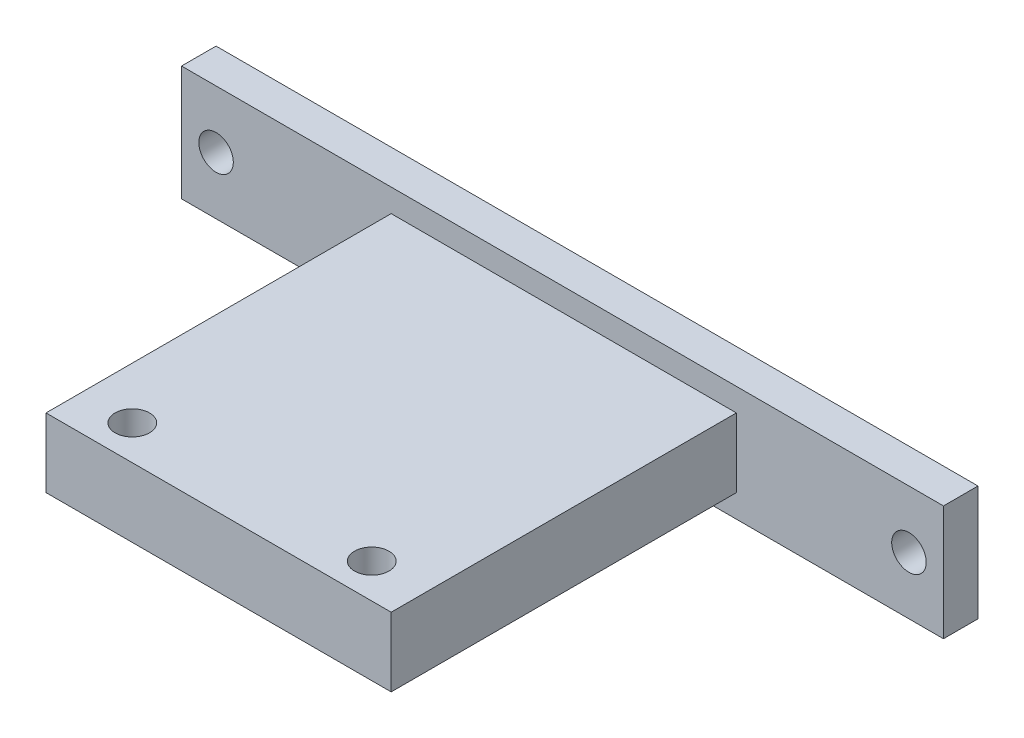
ISO-10303-21;
HEADER;
FILE_DESCRIPTION(('STEP AP214'),'2;1');
FILE_NAME('part.step','',(''),(''),'','','');
FILE_SCHEMA(('AUTOMOTIVE_DESIGN { 1 0 10303 214 1 1 1 1 }'));
ENDSEC;
DATA;
#1=APPLICATION_CONTEXT('core data for automotive mechanical design processes');
#2=APPLICATION_PROTOCOL_DEFINITION('international standard','automotive_design',2000,#1);
#3=PRODUCT_CONTEXT('',#1,'mechanical');
#4=PRODUCT('Part','Part','',(#3));
#5=PRODUCT_RELATED_PRODUCT_CATEGORY('part','',(#4));
#6=PRODUCT_DEFINITION_FORMATION('','',#4);
#7=PRODUCT_DEFINITION_CONTEXT('part definition',#1,'design');
#8=PRODUCT_DEFINITION('design','',#6,#7);
#9=PRODUCT_DEFINITION_SHAPE('','',#8);
#10=(LENGTH_UNIT() NAMED_UNIT(*) SI_UNIT(.MILLI.,.METRE.));
#11=(NAMED_UNIT(*) PLANE_ANGLE_UNIT() SI_UNIT($,.RADIAN.));
#12=(NAMED_UNIT(*) SI_UNIT($,.STERADIAN.) SOLID_ANGLE_UNIT());
#13=UNCERTAINTY_MEASURE_WITH_UNIT(LENGTH_MEASURE(1.E-05),#10,'distance_accuracy_value','');
#14=(GEOMETRIC_REPRESENTATION_CONTEXT(3) GLOBAL_UNCERTAINTY_ASSIGNED_CONTEXT((#13)) GLOBAL_UNIT_ASSIGNED_CONTEXT((#10,
#11,#12)) REPRESENTATION_CONTEXT('',''));
#15=CARTESIAN_POINT('',(0.,0.,0.));
#16=DIRECTION('',(0.,0.,1.));
#17=DIRECTION('',(1.,0.,0.));
#18=AXIS2_PLACEMENT_3D('',#15,#16,#17);
#19=CARTESIAN_POINT('',(0.,0.,3.));
#20=DIRECTION('',(0.,0.,1.));
#21=DIRECTION('',(1.,0.,0.));
#22=AXIS2_PLACEMENT_3D('',#19,#20,#21);
#23=PLANE('',#22);
#24=DIRECTION('',(0.,1.,0.));
#25=VECTOR('',#24,1.);
#26=CARTESIAN_POINT('',(63.22,0.,3.));
#27=LINE('',#26,#25);
#28=CARTESIAN_POINT('',(63.22,0.,3.));
#29=VERTEX_POINT('',#28);
#30=CARTESIAN_POINT('',(63.22,10.,3.));
#31=VERTEX_POINT('',#30);
#32=EDGE_CURVE('E162',#29,#31,#27,.T.);
#33=ORIENTED_EDGE('',*,*,#32,.T.);
#34=DIRECTION('',(-1.,0.,0.));
#35=VECTOR('',#34,1.);
#36=CARTESIAN_POINT('',(0.,10.,3.));
#37=LINE('',#36,#35);
#38=CARTESIAN_POINT('',(-3.,10.,3.));
#39=VERTEX_POINT('',#38);
#40=EDGE_CURVE('E166',#31,#39,#37,.T.);
#41=ORIENTED_EDGE('',*,*,#40,.T.);
#42=DIRECTION('',(0.,-1.,0.));
#43=VECTOR('',#42,1.);
#44=CARTESIAN_POINT('',(-3.,0.,3.));
#45=LINE('',#44,#43);
#46=CARTESIAN_POINT('',(-3.,0.,3.));
#47=VERTEX_POINT('',#46);
#48=EDGE_CURVE('E170',#39,#47,#45,.T.);
#49=ORIENTED_EDGE('',*,*,#48,.T.);
#50=DIRECTION('',(-1.,0.,0.));
#51=VECTOR('',#50,1.);
#52=CARTESIAN_POINT('',(0.,0.,3.));
#53=LINE('',#52,#51);
#54=EDGE_CURVE('E173',#29,#47,#53,.T.);
#55=ORIENTED_EDGE('',*,*,#54,.F.);
#56=EDGE_LOOP('',(#33,#41,#49,#55));
#57=FACE_BOUND('',#56,.T.);
#58=CARTESIAN_POINT('',(60.22,5.,3.));
#59=DIRECTION('',(0.,0.,1.));
#60=DIRECTION('',(1.,0.,0.));
#61=AXIS2_PLACEMENT_3D('',#58,#59,#60);
#62=CIRCLE('',#61,1.5);
#63=CARTESIAN_POINT('',(61.72,5.,3.));
#64=VERTEX_POINT('',#63);
#65=EDGE_CURVE('E177',#64,#64,#62,.T.);
#66=ORIENTED_EDGE('',*,*,#65,.F.);
#67=EDGE_LOOP('',(#66));
#68=FACE_BOUND('',#67,.T.);
#69=CARTESIAN_POINT('',(0.,5.,3.));
#70=DIRECTION('',(0.,0.,1.));
#71=DIRECTION('',(1.,0.,0.));
#72=AXIS2_PLACEMENT_3D('',#69,#70,#71);
#73=CIRCLE('',#72,1.5);
#74=CARTESIAN_POINT('',(1.5,5.,3.));
#75=VERTEX_POINT('',#74);
#76=EDGE_CURVE('E181',#75,#75,#73,.T.);
#77=ORIENTED_EDGE('',*,*,#76,.F.);
#78=EDGE_LOOP('',(#77));
#79=FACE_BOUND('',#78,.T.);
#80=DIRECTION('',(0.,1.,0.));
#81=VECTOR('',#80,1.);
#82=CARTESIAN_POINT('',(45.22,2.,3.));
#83=LINE('',#82,#81);
#84=CARTESIAN_POINT('',(45.22,2.,3.));
#85=VERTEX_POINT('',#84);
#86=CARTESIAN_POINT('',(45.22,8.,3.));
#87=VERTEX_POINT('',#86);
#88=EDGE_CURVE('E62',#85,#87,#83,.T.);
#89=ORIENTED_EDGE('',*,*,#88,.F.);
#90=DIRECTION('',(-1.,0.,0.));
#91=VECTOR('',#90,1.);
#92=CARTESIAN_POINT('',(15.22,2.,3.));
#93=LINE('',#92,#91);
#94=CARTESIAN_POINT('',(15.22,2.,3.));
#95=VERTEX_POINT('',#94);
#96=EDGE_CURVE('E57',#85,#95,#93,.T.);
#97=ORIENTED_EDGE('',*,*,#96,.T.);
#98=DIRECTION('',(0.,1.,0.));
#99=VECTOR('',#98,1.);
#100=CARTESIAN_POINT('',(15.22,2.,3.));
#101=LINE('',#100,#99);
#102=CARTESIAN_POINT('',(15.22,8.,3.));
#103=VERTEX_POINT('',#102);
#104=EDGE_CURVE('E154',#95,#103,#101,.T.);
#105=ORIENTED_EDGE('',*,*,#104,.T.);
#106=DIRECTION('',(-1.,0.,0.));
#107=VECTOR('',#106,1.);
#108=CARTESIAN_POINT('',(15.22,8.,3.));
#109=LINE('',#108,#107);
#110=EDGE_CURVE('E130',#87,#103,#109,.T.);
#111=ORIENTED_EDGE('',*,*,#110,.F.);
#112=EDGE_LOOP('',(#89,#97,#105,#111));
#113=FACE_BOUND('',#112,.T.);
#114=ADVANCED_FACE('F39',(#57,#68,#79,#113),#23,.T.);
#115=CARTESIAN_POINT('',(63.22,0.,3.));
#116=DIRECTION('',(-1.,0.,0.));
#117=DIRECTION('',(0.,0.,1.));
#118=AXIS2_PLACEMENT_3D('',#115,#116,#117);
#119=PLANE('',#118);
#120=DIRECTION('',(0.,1.,0.));
#121=VECTOR('',#120,1.);
#122=CARTESIAN_POINT('',(63.22,0.,0.));
#123=LINE('',#122,#121);
#124=CARTESIAN_POINT('',(63.22,0.,0.));
#125=VERTEX_POINT('',#124);
#126=CARTESIAN_POINT('',(63.22,10.,0.));
#127=VERTEX_POINT('',#126);
#128=EDGE_CURVE('E157',#125,#127,#123,.T.);
#129=ORIENTED_EDGE('',*,*,#128,.T.);
#130=DIRECTION('',(0.,0.,-1.));
#131=VECTOR('',#130,1.);
#132=CARTESIAN_POINT('',(63.22,10.,3.));
#133=LINE('',#132,#131);
#134=EDGE_CURVE('E11',#31,#127,#133,.T.);
#135=ORIENTED_EDGE('',*,*,#134,.F.);
#136=ORIENTED_EDGE('',*,*,#32,.F.);
#137=DIRECTION('',(0.,0.,-1.));
#138=VECTOR('',#137,1.);
#139=CARTESIAN_POINT('',(63.22,0.,3.));
#140=LINE('',#139,#138);
#141=EDGE_CURVE('E185',#29,#125,#140,.T.);
#142=ORIENTED_EDGE('',*,*,#141,.T.);
#143=EDGE_LOOP('',(#129,#135,#136,#142));
#144=FACE_BOUND('',#143,.T.);
#145=ADVANCED_FACE('F41',(#144),#119,.F.);
#146=CARTESIAN_POINT('',(0.,10.,3.));
#147=DIRECTION('',(0.,-1.,0.));
#148=DIRECTION('',(0.,0.,-1.));
#149=AXIS2_PLACEMENT_3D('',#146,#147,#148);
#150=PLANE('',#149);
#151=DIRECTION('',(-1.,0.,0.));
#152=VECTOR('',#151,1.);
#153=CARTESIAN_POINT('',(0.,10.,0.));
#154=LINE('',#153,#152);
#155=CARTESIAN_POINT('',(-3.,10.,0.));
#156=VERTEX_POINT('',#155);
#157=EDGE_CURVE('E189',#127,#156,#154,.T.);
#158=ORIENTED_EDGE('',*,*,#157,.T.);
#159=DIRECTION('',(0.,0.,-1.));
#160=VECTOR('',#159,1.);
#161=CARTESIAN_POINT('',(-3.,10.,3.));
#162=LINE('',#161,#160);
#163=EDGE_CURVE('E49',#39,#156,#162,.T.);
#164=ORIENTED_EDGE('',*,*,#163,.F.);
#165=ORIENTED_EDGE('',*,*,#40,.F.);
#166=ORIENTED_EDGE('',*,*,#134,.T.);
#167=EDGE_LOOP('',(#158,#164,#165,#166));
#168=FACE_BOUND('',#167,.T.);
#169=ADVANCED_FACE('F252',(#168),#150,.F.);
#170=CARTESIAN_POINT('',(-3.,0.,3.));
#171=DIRECTION('',(1.,0.,0.));
#172=DIRECTION('',(0.,1.,0.));
#173=AXIS2_PLACEMENT_3D('',#170,#171,#172);
#174=PLANE('',#173);
#175=DIRECTION('',(0.,-1.,0.));
#176=VECTOR('',#175,1.);
#177=CARTESIAN_POINT('',(-3.,0.,0.));
#178=LINE('',#177,#176);
#179=CARTESIAN_POINT('',(-3.,0.,0.));
#180=VERTEX_POINT('',#179);
#181=EDGE_CURVE('E192',#156,#180,#178,.T.);
#182=ORIENTED_EDGE('',*,*,#181,.T.);
#183=DIRECTION('',(0.,0.,-1.));
#184=VECTOR('',#183,1.);
#185=CARTESIAN_POINT('',(-3.,0.,3.));
#186=LINE('',#185,#184);
#187=EDGE_CURVE('E209',#47,#180,#186,.T.);
#188=ORIENTED_EDGE('',*,*,#187,.F.);
#189=ORIENTED_EDGE('',*,*,#48,.F.);
#190=ORIENTED_EDGE('',*,*,#163,.T.);
#191=EDGE_LOOP('',(#182,#188,#189,#190));
#192=FACE_BOUND('',#191,.T.);
#193=ADVANCED_FACE('F267',(#192),#174,.F.);
#194=CARTESIAN_POINT('',(60.22,5.,3.));
#195=DIRECTION('',(0.,0.,-1.));
#196=DIRECTION('',(-1.,0.,0.));
#197=AXIS2_PLACEMENT_3D('',#194,#195,#196);
#198=CYLINDRICAL_SURFACE('',#197,1.5);
#199=ORIENTED_EDGE('',*,*,#65,.T.);
#200=EDGE_LOOP('',(#199));
#201=FACE_BOUND('',#200,.T.);
#202=CARTESIAN_POINT('',(60.22,5.,0.));
#203=DIRECTION('',(0.,0.,1.));
#204=DIRECTION('',(1.,0.,0.));
#205=AXIS2_PLACEMENT_3D('',#202,#203,#204);
#206=CIRCLE('',#205,1.5);
#207=CARTESIAN_POINT('',(61.72,5.,0.));
#208=VERTEX_POINT('',#207);
#209=EDGE_CURVE('E200',#208,#208,#206,.T.);
#210=ORIENTED_EDGE('',*,*,#209,.F.);
#211=EDGE_LOOP('',(#210));
#212=FACE_BOUND('',#211,.T.);
#213=ADVANCED_FACE('F264',(#201,#212),#198,.F.);
#214=CARTESIAN_POINT('',(0.,0.,3.));
#215=DIRECTION('',(0.,-1.,0.));
#216=DIRECTION('',(1.,0.,0.));
#217=AXIS2_PLACEMENT_3D('',#214,#215,#216);
#218=PLANE('',#217);
#219=DIRECTION('',(-1.,0.,0.));
#220=VECTOR('',#219,1.);
#221=CARTESIAN_POINT('',(0.,0.,0.));
#222=LINE('',#221,#220);
#223=EDGE_CURVE('E196',#125,#180,#222,.T.);
#224=ORIENTED_EDGE('',*,*,#223,.F.);
#225=ORIENTED_EDGE('',*,*,#141,.F.);
#226=ORIENTED_EDGE('',*,*,#54,.T.);
#227=ORIENTED_EDGE('',*,*,#187,.T.);
#228=EDGE_LOOP('',(#224,#225,#226,#227));
#229=FACE_BOUND('',#228,.T.);
#230=ADVANCED_FACE('F262',(#229),#218,.T.);
#231=CARTESIAN_POINT('',(0.,5.,3.));
#232=DIRECTION('',(0.,0.,-1.));
#233=DIRECTION('',(-1.,0.,0.));
#234=AXIS2_PLACEMENT_3D('',#231,#232,#233);
#235=CYLINDRICAL_SURFACE('',#234,1.5);
#236=ORIENTED_EDGE('',*,*,#76,.T.);
#237=EDGE_LOOP('',(#236));
#238=FACE_BOUND('',#237,.T.);
#239=CARTESIAN_POINT('',(0.,5.,0.));
#240=DIRECTION('',(0.,0.,1.));
#241=DIRECTION('',(1.,0.,0.));
#242=AXIS2_PLACEMENT_3D('',#239,#240,#241);
#243=CIRCLE('',#242,1.5);
#244=CARTESIAN_POINT('',(1.5,5.,0.));
#245=VERTEX_POINT('',#244);
#246=EDGE_CURVE('E167',#245,#245,#243,.T.);
#247=ORIENTED_EDGE('',*,*,#246,.F.);
#248=EDGE_LOOP('',(#247));
#249=FACE_BOUND('',#248,.T.);
#250=ADVANCED_FACE('F258',(#238,#249),#235,.F.);
#251=CARTESIAN_POINT('',(0.,0.,0.));
#252=DIRECTION('',(0.,0.,1.));
#253=DIRECTION('',(1.,0.,0.));
#254=AXIS2_PLACEMENT_3D('',#251,#252,#253);
#255=PLANE('',#254);
#256=ORIENTED_EDGE('',*,*,#128,.F.);
#257=ORIENTED_EDGE('',*,*,#223,.T.);
#258=ORIENTED_EDGE('',*,*,#181,.F.);
#259=ORIENTED_EDGE('',*,*,#157,.F.);
#260=EDGE_LOOP('',(#256,#257,#258,#259));
#261=FACE_BOUND('',#260,.T.);
#262=ORIENTED_EDGE('',*,*,#209,.T.);
#263=EDGE_LOOP('',(#262));
#264=FACE_BOUND('',#263,.T.);
#265=ORIENTED_EDGE('',*,*,#246,.T.);
#266=EDGE_LOOP('',(#265));
#267=FACE_BOUND('',#266,.T.);
#268=ADVANCED_FACE('F244',(#261,#264,#267),#255,.F.);
#269=CARTESIAN_POINT('',(15.22,2.,3.));
#270=DIRECTION('',(-1.,0.,0.));
#271=DIRECTION('',(0.,0.,1.));
#272=AXIS2_PLACEMENT_3D('',#269,#270,#271);
#273=PLANE('',#272);
#274=DIRECTION('',(0.,1.,0.));
#275=VECTOR('',#274,1.);
#276=CARTESIAN_POINT('',(15.22,2.,33.));
#277=LINE('',#276,#275);
#278=CARTESIAN_POINT('',(15.22,2.,33.));
#279=VERTEX_POINT('',#278);
#280=CARTESIAN_POINT('',(15.22,8.,33.));
#281=VERTEX_POINT('',#280);
#282=EDGE_CURVE('E106',#279,#281,#277,.T.);
#283=ORIENTED_EDGE('',*,*,#282,.T.);
#284=DIRECTION('',(0.,0.,1.));
#285=VECTOR('',#284,1.);
#286=CARTESIAN_POINT('',(15.22,8.,3.));
#287=LINE('',#286,#285);
#288=EDGE_CURVE('E110',#103,#281,#287,.T.);
#289=ORIENTED_EDGE('',*,*,#288,.F.);
#290=ORIENTED_EDGE('',*,*,#104,.F.);
#291=DIRECTION('',(0.,0.,1.));
#292=VECTOR('',#291,1.);
#293=CARTESIAN_POINT('',(15.22,2.,3.));
#294=LINE('',#293,#292);
#295=EDGE_CURVE('E112',#95,#279,#294,.T.);
#296=ORIENTED_EDGE('',*,*,#295,.T.);
#297=EDGE_LOOP('',(#283,#289,#290,#296));
#298=FACE_BOUND('',#297,.T.);
#299=ADVANCED_FACE('F108',(#298),#273,.T.);
#300=CARTESIAN_POINT('',(45.22,2.,3.));
#301=DIRECTION('',(1.,0.,0.));
#302=DIRECTION('',(0.,0.,-1.));
#303=AXIS2_PLACEMENT_3D('',#300,#301,#302);
#304=PLANE('',#303);
#305=ORIENTED_EDGE('',*,*,#88,.T.);
#306=DIRECTION('',(0.,0.,-1.));
#307=VECTOR('',#306,1.);
#308=CARTESIAN_POINT('',(45.22,8.,3.));
#309=LINE('',#308,#307);
#310=CARTESIAN_POINT('',(45.22,8.,33.));
#311=VERTEX_POINT('',#310);
#312=EDGE_CURVE('E126',#311,#87,#309,.T.);
#313=ORIENTED_EDGE('',*,*,#312,.F.);
#314=DIRECTION('',(0.,1.,0.));
#315=VECTOR('',#314,1.);
#316=CARTESIAN_POINT('',(45.22,2.,33.));
#317=LINE('',#316,#315);
#318=CARTESIAN_POINT('',(45.22,2.,33.));
#319=VERTEX_POINT('',#318);
#320=EDGE_CURVE('E117',#319,#311,#317,.T.);
#321=ORIENTED_EDGE('',*,*,#320,.F.);
#322=DIRECTION('',(0.,0.,-1.));
#323=VECTOR('',#322,1.);
#324=CARTESIAN_POINT('',(45.22,2.,3.));
#325=LINE('',#324,#323);
#326=EDGE_CURVE('E149',#319,#85,#325,.T.);
#327=ORIENTED_EDGE('',*,*,#326,.T.);
#328=EDGE_LOOP('',(#305,#313,#321,#327));
#329=FACE_BOUND('',#328,.T.);
#330=ADVANCED_FACE('F236',(#329),#304,.T.);
#331=CARTESIAN_POINT('',(15.22,2.,33.));
#332=DIRECTION('',(0.,0.,1.));
#333=DIRECTION('',(1.,0.,0.));
#334=AXIS2_PLACEMENT_3D('',#331,#332,#333);
#335=PLANE('',#334);
#336=ORIENTED_EDGE('',*,*,#320,.T.);
#337=DIRECTION('',(1.,0.,0.));
#338=VECTOR('',#337,1.);
#339=CARTESIAN_POINT('',(15.22,8.,33.));
#340=LINE('',#339,#338);
#341=EDGE_CURVE('E120',#281,#311,#340,.T.);
#342=ORIENTED_EDGE('',*,*,#341,.F.);
#343=ORIENTED_EDGE('',*,*,#282,.F.);
#344=DIRECTION('',(1.,0.,0.));
#345=VECTOR('',#344,1.);
#346=CARTESIAN_POINT('',(15.22,2.,33.));
#347=LINE('',#346,#345);
#348=EDGE_CURVE('E146',#279,#319,#347,.T.);
#349=ORIENTED_EDGE('',*,*,#348,.T.);
#350=EDGE_LOOP('',(#336,#342,#343,#349));
#351=FACE_BOUND('',#350,.T.);
#352=ADVANCED_FACE('F121',(#351),#335,.T.);
#353=CARTESIAN_POINT('',(0.,2.,0.));
#354=DIRECTION('',(0.,1.,0.));
#355=DIRECTION('',(0.,0.,1.));
#356=AXIS2_PLACEMENT_3D('',#353,#354,#355);
#357=PLANE('',#356);
#358=CARTESIAN_POINT('',(19.72,2.,30.));
#359=DIRECTION('',(0.,-1.,0.));
#360=DIRECTION('',(0.,0.,-1.));
#361=AXIS2_PLACEMENT_3D('',#358,#359,#360);
#362=CIRCLE('',#361,1.5);
#363=CARTESIAN_POINT('',(19.72,2.,28.5));
#364=VERTEX_POINT('',#363);
#365=EDGE_CURVE('E216',#364,#364,#362,.T.);
#366=ORIENTED_EDGE('',*,*,#365,.F.);
#367=EDGE_LOOP('',(#366));
#368=FACE_BOUND('',#367,.T.);
#369=CARTESIAN_POINT('',(40.53,2.,30.));
#370=DIRECTION('',(0.,-1.,0.));
#371=DIRECTION('',(0.,0.,-1.));
#372=AXIS2_PLACEMENT_3D('',#369,#370,#371);
#373=CIRCLE('',#372,1.5);
#374=CARTESIAN_POINT('',(40.53,2.,28.5));
#375=VERTEX_POINT('',#374);
#376=EDGE_CURVE('E137',#375,#375,#373,.T.);
#377=ORIENTED_EDGE('',*,*,#376,.F.);
#378=EDGE_LOOP('',(#377));
#379=FACE_BOUND('',#378,.T.);
#380=ORIENTED_EDGE('',*,*,#295,.F.);
#381=ORIENTED_EDGE('',*,*,#96,.F.);
#382=ORIENTED_EDGE('',*,*,#326,.F.);
#383=ORIENTED_EDGE('',*,*,#348,.F.);
#384=EDGE_LOOP('',(#380,#381,#382,#383));
#385=FACE_BOUND('',#384,.T.);
#386=ADVANCED_FACE('F229',(#368,#379,#385),#357,.F.);
#387=CARTESIAN_POINT('',(0.,8.,0.));
#388=DIRECTION('',(0.,1.,0.));
#389=DIRECTION('',(0.,0.,1.));
#390=AXIS2_PLACEMENT_3D('',#387,#388,#389);
#391=PLANE('',#390);
#392=CARTESIAN_POINT('',(19.72,8.,30.));
#393=DIRECTION('',(0.,1.,0.));
#394=DIRECTION('',(0.,0.,1.));
#395=AXIS2_PLACEMENT_3D('',#392,#393,#394);
#396=CIRCLE('',#395,1.5);
#397=CARTESIAN_POINT('',(19.72,8.,31.5));
#398=VERTEX_POINT('',#397);
#399=EDGE_CURVE('E43',#398,#398,#396,.T.);
#400=ORIENTED_EDGE('',*,*,#399,.F.);
#401=EDGE_LOOP('',(#400));
#402=FACE_BOUND('',#401,.T.);
#403=CARTESIAN_POINT('',(40.53,8.,30.));
#404=DIRECTION('',(0.,1.,0.));
#405=DIRECTION('',(0.,0.,1.));
#406=AXIS2_PLACEMENT_3D('',#403,#404,#405);
#407=CIRCLE('',#406,1.5);
#408=CARTESIAN_POINT('',(40.53,8.,31.5));
#409=VERTEX_POINT('',#408);
#410=EDGE_CURVE('E135',#409,#409,#407,.T.);
#411=ORIENTED_EDGE('',*,*,#410,.F.);
#412=EDGE_LOOP('',(#411));
#413=FACE_BOUND('',#412,.T.);
#414=ORIENTED_EDGE('',*,*,#288,.T.);
#415=ORIENTED_EDGE('',*,*,#341,.T.);
#416=ORIENTED_EDGE('',*,*,#312,.T.);
#417=ORIENTED_EDGE('',*,*,#110,.T.);
#418=EDGE_LOOP('',(#414,#415,#416,#417));
#419=FACE_BOUND('',#418,.T.);
#420=ADVANCED_FACE('F129',(#402,#413,#419),#391,.T.);
#421=CARTESIAN_POINT('',(40.53,10.,30.));
#422=DIRECTION('',(0.,-1.,0.));
#423=DIRECTION('',(0.,0.,-1.));
#424=AXIS2_PLACEMENT_3D('',#421,#422,#423);
#425=CYLINDRICAL_SURFACE('',#424,1.5);
#426=ORIENTED_EDGE('',*,*,#410,.T.);
#427=EDGE_LOOP('',(#426));
#428=FACE_BOUND('',#427,.T.);
#429=ORIENTED_EDGE('',*,*,#376,.T.);
#430=EDGE_LOOP('',(#429));
#431=FACE_BOUND('',#430,.T.);
#432=ADVANCED_FACE('F227',(#428,#431),#425,.F.);
#433=CARTESIAN_POINT('',(19.72,10.,30.));
#434=DIRECTION('',(0.,-1.,0.));
#435=DIRECTION('',(0.,0.,-1.));
#436=AXIS2_PLACEMENT_3D('',#433,#434,#435);
#437=CYLINDRICAL_SURFACE('',#436,1.5);
#438=ORIENTED_EDGE('',*,*,#399,.T.);
#439=EDGE_LOOP('',(#438));
#440=FACE_BOUND('',#439,.T.);
#441=ORIENTED_EDGE('',*,*,#365,.T.);
#442=EDGE_LOOP('',(#441));
#443=FACE_BOUND('',#442,.T.);
#444=ADVANCED_FACE('F355',(#440,#443),#437,.F.);
#445=CLOSED_SHELL('',(#114,#145,#169,#193,#213,#230,#250,#268,#299,#330,#352,#386,#420,#432,#444));
#446=MANIFOLD_SOLID_BREP('B2',#445);
#447=ADVANCED_BREP_SHAPE_REPRESENTATION('',(#18,#446),#14);
#448=SHAPE_DEFINITION_REPRESENTATION(#9,#447);
ENDSEC;
END-ISO-10303-21;
